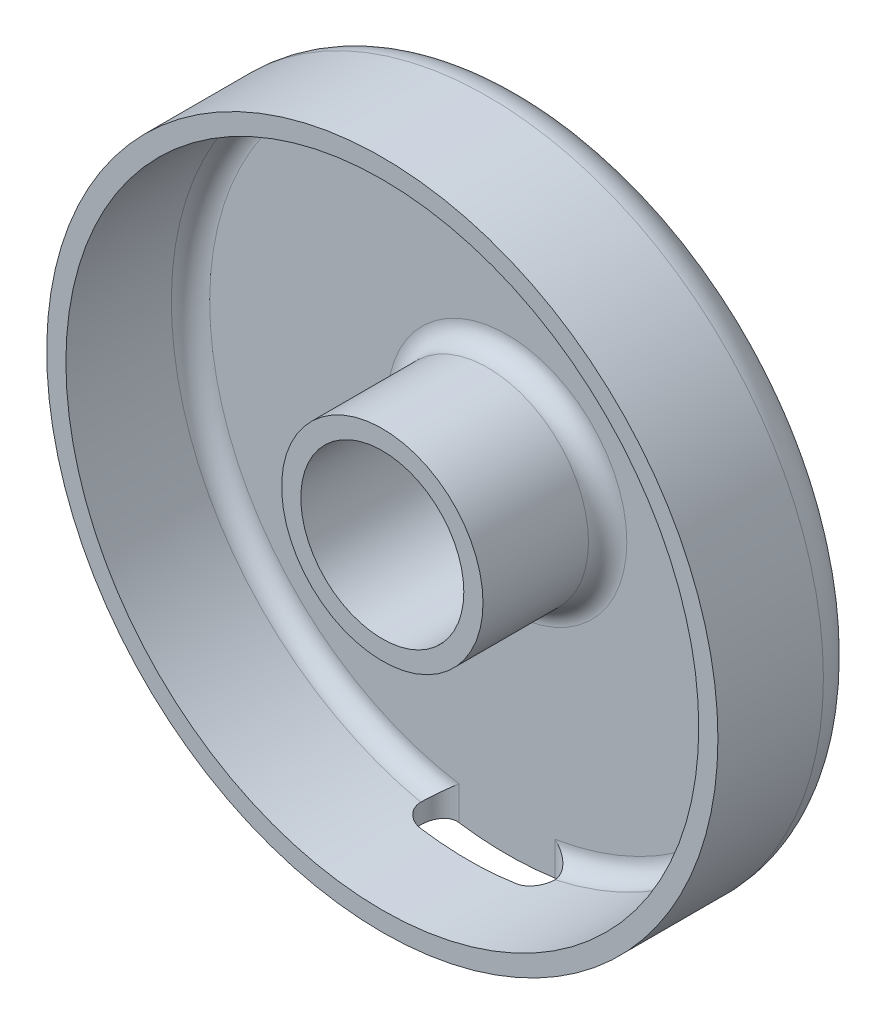
ISO-10303-21;
HEADER;
FILE_DESCRIPTION(('STEP AP214'),'2;1');
FILE_NAME('part.step','',(''),(''),'','','');
FILE_SCHEMA(('AUTOMOTIVE_DESIGN { 1 0 10303 214 1 1 1 1 }'));
ENDSEC;
DATA;
#1=APPLICATION_CONTEXT('core data for automotive mechanical design processes');
#2=APPLICATION_PROTOCOL_DEFINITION('international standard','automotive_design',2000,#1);
#3=PRODUCT_CONTEXT('',#1,'mechanical');
#4=PRODUCT('Part','Part','',(#3));
#5=PRODUCT_RELATED_PRODUCT_CATEGORY('part','',(#4));
#6=PRODUCT_DEFINITION_FORMATION('','',#4);
#7=PRODUCT_DEFINITION_CONTEXT('part definition',#1,'design');
#8=PRODUCT_DEFINITION('design','',#6,#7);
#9=PRODUCT_DEFINITION_SHAPE('','',#8);
#10=(LENGTH_UNIT() NAMED_UNIT(*) SI_UNIT(.MILLI.,.METRE.));
#11=(NAMED_UNIT(*) PLANE_ANGLE_UNIT() SI_UNIT($,.RADIAN.));
#12=(NAMED_UNIT(*) SI_UNIT($,.STERADIAN.) SOLID_ANGLE_UNIT());
#13=UNCERTAINTY_MEASURE_WITH_UNIT(LENGTH_MEASURE(1.E-05),#10,'distance_accuracy_value','');
#14=(GEOMETRIC_REPRESENTATION_CONTEXT(3) GLOBAL_UNCERTAINTY_ASSIGNED_CONTEXT((#13)) GLOBAL_UNIT_ASSIGNED_CONTEXT((#10,
#11,#12)) REPRESENTATION_CONTEXT('',''));
#15=CARTESIAN_POINT('',(0.,0.,0.));
#16=DIRECTION('',(0.,0.,1.));
#17=DIRECTION('',(1.,0.,0.));
#18=AXIS2_PLACEMENT_3D('',#15,#16,#17);
#19=CARTESIAN_POINT('',(0.,0.,15.));
#20=DIRECTION('',(0.,0.,1.));
#21=DIRECTION('',(1.,0.,0.));
#22=AXIS2_PLACEMENT_3D('',#19,#20,#21);
#23=PLANE('',#22);
#24=CARTESIAN_POINT('',(0.,0.,15.));
#25=DIRECTION('',(0.,0.,1.));
#26=DIRECTION('',(1.,0.,0.));
#27=AXIS2_PLACEMENT_3D('',#24,#25,#26);
#28=CIRCLE('',#27,8.5);
#29=CARTESIAN_POINT('',(8.5,0.,15.));
#30=VERTEX_POINT('',#29);
#31=EDGE_CURVE('E173',#30,#30,#28,.T.);
#32=ORIENTED_EDGE('',*,*,#31,.F.);
#33=EDGE_LOOP('',(#32));
#34=FACE_BOUND('',#33,.T.);
#35=CARTESIAN_POINT('',(0.,0.,15.));
#36=DIRECTION('',(0.,0.,1.));
#37=DIRECTION('',(1.,0.,0.));
#38=AXIS2_PLACEMENT_3D('',#35,#36,#37);
#39=CIRCLE('',#38,10.5);
#40=CARTESIAN_POINT('',(10.5,0.,15.));
#41=VERTEX_POINT('',#40);
#42=EDGE_CURVE('E98',#41,#41,#39,.T.);
#43=ORIENTED_EDGE('',*,*,#42,.T.);
#44=EDGE_LOOP('',(#43));
#45=FACE_BOUND('',#44,.T.);
#46=ADVANCED_FACE('F33',(#34,#45),#23,.T.);
#47=CARTESIAN_POINT('',(0.,0.,15.));
#48=DIRECTION('',(0.,0.,-1.));
#49=DIRECTION('',(-1.,0.,0.));
#50=AXIS2_PLACEMENT_3D('',#47,#48,#49);
#51=CYLINDRICAL_SURFACE('',#50,35.);
#52=CARTESIAN_POINT('',(0.,0.,4.));
#53=DIRECTION('',(0.,0.,1.));
#54=DIRECTION('',(1.,0.,0.));
#55=AXIS2_PLACEMENT_3D('',#52,#53,#54);
#56=CIRCLE('',#55,35.);
#57=CARTESIAN_POINT('',(7.,-34.2928563989645,4.));
#58=VERTEX_POINT('',#57);
#59=CARTESIAN_POINT('',(-7.,-34.2928563989645,4.));
#60=VERTEX_POINT('',#59);
#61=EDGE_CURVE('E196',#58,#60,#56,.T.);
#62=ORIENTED_EDGE('',*,*,#61,.T.);
#63=CARTESIAN_POINT('',(-7.,-34.2928563989645,4.));
#64=CARTESIAN_POINT('',(-7.00000024530008,-34.2928555590461,4.05551355530177));
#65=CARTESIAN_POINT('',(-6.99768719378157,-34.2933285851383,4.11100014356259));
#66=CARTESIAN_POINT('',(-6.9884636017292,-34.2952097134133,4.22156839814736));
#67=CARTESIAN_POINT('',(-6.9815535157915,-34.2966177231365,4.27665010396523));
#68=CARTESIAN_POINT('',(-6.95401289387718,-34.3022168043985,4.44052674764076));
#69=CARTESIAN_POINT('',(-6.92657168154917,-34.3077830497015,4.54821132621806));
#70=CARTESIAN_POINT('',(-6.85437600773371,-34.3222794650378,4.75732863114436));
#71=CARTESIAN_POINT('',(-6.80961750180681,-34.3312104208836,4.8587598906155));
#72=CARTESIAN_POINT('',(-6.70414730815314,-34.3519619063264,5.05264191439974));
#73=CARTESIAN_POINT('',(-6.64343523137788,-34.3637825063906,5.14509245963118));
#74=CARTESIAN_POINT('',(-6.50713708225238,-34.3898533831215,5.3194349637285));
#75=CARTESIAN_POINT('',(-6.43140571292647,-34.404127196416,5.40120969889844));
#76=CARTESIAN_POINT('',(-6.26760925689824,-34.4343432891605,5.55096207681369));
#77=CARTESIAN_POINT('',(-6.17954109511379,-34.4502859843465,5.61893626924223));
#78=CARTESIAN_POINT('',(-5.99184757603775,-34.4834307316268,5.74039033875451));
#79=CARTESIAN_POINT('',(-5.8920440114934,-34.5006501812278,5.793589890895));
#80=CARTESIAN_POINT('',(-5.68497216612578,-34.5353744470497,5.88241609208592));
#81=CARTESIAN_POINT('',(-5.57770742555432,-34.552879124954,5.9180510113413));
#82=CARTESIAN_POINT('',(-5.39164042562375,-34.5823109799937,5.96286384332794));
#83=CARTESIAN_POINT('',(-5.31395887068838,-34.5943352148722,5.97677250905686));
#84=CARTESIAN_POINT('',(-5.15754252987711,-34.6180022564221,5.99534108602722));
#85=CARTESIAN_POINT('',(-5.07880918450185,-34.6296455218188,6.00001255556704));
#86=CARTESIAN_POINT('',(-5.,-34.6410161513776,6.));
#87=B_SPLINE_CURVE_WITH_KNOTS('',3,(#63,#64,#65,#66,#67,#68,#69,#70,#71,#72,#73,#74,#75,#76,#77,
#78,#79,#80,#81,#82,#83,#84,#85,#86),.UNSPECIFIED.,.F.,.F.,(4,2,2,2,2,2,2,2,2,2,2,4),(0.,
0.166437126251119,0.332857796146538,0.66493476339948,0.997089333811798,1.32925200499525,
1.66480026794702,2.00043231934013,2.34205427832008,2.68351523257436,2.92248444549073,
3.16115445184396),.UNSPECIFIED.);
#88=CARTESIAN_POINT('',(-5.,-34.6410161513776,6.));
#89=VERTEX_POINT('',#88);
#90=EDGE_CURVE('E93',#60,#89,#87,.T.);
#91=ORIENTED_EDGE('',*,*,#90,.T.);
#92=CARTESIAN_POINT('',(0.,0.,6.));
#93=DIRECTION('',(0.,0.,1.));
#94=DIRECTION('',(1.,0.,0.));
#95=AXIS2_PLACEMENT_3D('',#92,#93,#94);
#96=CIRCLE('',#95,35.);
#97=CARTESIAN_POINT('',(5.,-34.6410161513776,6.));
#98=VERTEX_POINT('',#97);
#99=EDGE_CURVE('E86',#89,#98,#96,.T.);
#100=ORIENTED_EDGE('',*,*,#99,.T.);
#101=CARTESIAN_POINT('',(5.,-34.6410161513776,6.));
#102=CARTESIAN_POINT('',(5.05695062841561,-34.6327968394874,5.99999935998623));
#103=CARTESIAN_POINT('',(5.11385274952817,-34.6244393737466,5.99756603626248));
#104=CARTESIAN_POINT('',(5.22720720797549,-34.6075075796392,5.98786720303881));
#105=CARTESIAN_POINT('',(5.28365957576101,-34.5989332661213,5.98060202354457));
#106=CARTESIAN_POINT('',(5.45165220241039,-34.5729991146888,5.95163769943295));
#107=CARTESIAN_POINT('',(5.56200532845806,-34.5554024172875,5.92276954139059));
#108=CARTESIAN_POINT('',(5.77620788126942,-34.5202439513139,5.84673777672149));
#109=CARTESIAN_POINT('',(5.88005477947362,-34.5026821988584,5.79956710766766));
#110=CARTESIAN_POINT('',(6.07833427206034,-34.468303957287,5.68822765776918));
#111=CARTESIAN_POINT('',(6.17276832854968,-34.4514873526527,5.62406152252932));
#112=CARTESIAN_POINT('',(6.34945874201338,-34.4193615543715,5.48051100933139));
#113=CARTESIAN_POINT('',(6.43172247410127,-34.404051449698,5.40113591536918));
#114=CARTESIAN_POINT('',(6.58172257793654,-34.3756712008395,5.22929160065911));
#115=CARTESIAN_POINT('',(6.64945685510899,-34.3626013796695,5.13682049516819));
#116=CARTESIAN_POINT('',(6.76755997390268,-34.3395358476454,4.94260196129102));
#117=CARTESIAN_POINT('',(6.81812949674207,-34.3295047700626,4.84098066405441));
#118=CARTESIAN_POINT('',(6.90140198536068,-34.3128615635967,4.63044231809053));
#119=CARTESIAN_POINT('',(6.93412015993054,-34.3062465246136,4.52153156885347));
#120=CARTESIAN_POINT('',(6.9715504714405,-34.2986543055428,4.34315718701884));
#121=CARTESIAN_POINT('',(6.98221180130755,-34.2964838790439,4.27493567951671));
#122=CARTESIAN_POINT('',(6.99643525916125,-34.2935841079102,4.13782038199207));
#123=CARTESIAN_POINT('',(7.00000701015909,-34.2928528098919,4.06892763097816));
#124=CARTESIAN_POINT('',(7.,-34.2928563989645,4.));
#125=B_SPLINE_CURVE_WITH_KNOTS('',3,(#101,#102,#103,#104,#105,#106,#107,#108,#109,#110,#111,
#112,#113,#114,#115,#116,#117,#118,#119,#120,#121,#122,#123,#124),.UNSPECIFIED.,.F.,.F.,(4,2,2,
2,2,2,2,2,2,2,2,4),(0.,0.172514735017035,0.345017688847394,0.689492877116225,1.03410112113017,
1.37865575308445,1.72300072498184,2.06739530454463,2.40761227498084,2.74753893677924,
2.95443865653663,3.16105734922718),.UNSPECIFIED.);
#126=EDGE_CURVE('E91',#98,#58,#125,.T.);
#127=ORIENTED_EDGE('',*,*,#126,.T.);
#128=EDGE_LOOP('',(#62,#91,#100,#127));
#129=FACE_BOUND('',#128,.T.);
#130=CARTESIAN_POINT('',(0.,0.,15.));
#131=DIRECTION('',(0.,0.,1.));
#132=DIRECTION('',(1.,0.,0.));
#133=AXIS2_PLACEMENT_3D('',#130,#131,#132);
#134=CIRCLE('',#133,35.);
#135=CARTESIAN_POINT('',(35.,0.,15.));
#136=VERTEX_POINT('',#135);
#137=EDGE_CURVE('E179',#136,#136,#134,.T.);
#138=ORIENTED_EDGE('',*,*,#137,.F.);
#139=EDGE_LOOP('',(#138));
#140=FACE_BOUND('',#139,.T.);
#141=ADVANCED_FACE('F89',(#129,#140),#51,.T.);
#142=CARTESIAN_POINT('',(0.,0.,15.));
#143=DIRECTION('',(0.,0.,1.));
#144=DIRECTION('',(1.,0.,0.));
#145=AXIS2_PLACEMENT_3D('',#142,#143,#144);
#146=CIRCLE('',#145,33.);
#147=CARTESIAN_POINT('',(33.,0.,15.));
#148=VERTEX_POINT('',#147);
#149=EDGE_CURVE('E170',#148,#148,#146,.T.);
#150=ORIENTED_EDGE('',*,*,#149,.F.);
#151=EDGE_LOOP('',(#150));
#152=FACE_BOUND('',#151,.T.);
#153=ORIENTED_EDGE('',*,*,#137,.T.);
#154=EDGE_LOOP('',(#153));
#155=FACE_BOUND('',#154,.T.);
#156=ADVANCED_FACE('F226',(#152,#155),#23,.T.);
#157=CARTESIAN_POINT('',(0.,0.,0.));
#158=DIRECTION('',(0.,0.,1.));
#159=DIRECTION('',(1.,0.,0.));
#160=AXIS2_PLACEMENT_3D('',#157,#158,#159);
#161=PLANE('',#160);
#162=CARTESIAN_POINT('',(0.,0.,0.));
#163=DIRECTION('',(0.,0.,1.));
#164=DIRECTION('',(1.,0.,0.));
#165=AXIS2_PLACEMENT_3D('',#162,#163,#164);
#166=CIRCLE('',#165,31.);
#167=CARTESIAN_POINT('',(31.,0.,0.));
#168=VERTEX_POINT('',#167);
#169=EDGE_CURVE('E197',#168,#168,#166,.F.);
#170=ORIENTED_EDGE('',*,*,#169,.T.);
#171=EDGE_LOOP('',(#170));
#172=FACE_BOUND('',#171,.T.);
#173=CARTESIAN_POINT('',(0.,0.,0.));
#174=DIRECTION('',(0.,0.,1.));
#175=DIRECTION('',(1.,0.,0.));
#176=AXIS2_PLACEMENT_3D('',#173,#174,#175);
#177=CIRCLE('',#176,8.5);
#178=CARTESIAN_POINT('',(8.5,0.,0.));
#179=VERTEX_POINT('',#178);
#180=EDGE_CURVE('E176',#179,#179,#177,.T.);
#181=ORIENTED_EDGE('',*,*,#180,.T.);
#182=EDGE_LOOP('',(#181));
#183=FACE_BOUND('',#182,.T.);
#184=ADVANCED_FACE('F234',(#172,#183),#161,.F.);
#185=CARTESIAN_POINT('',(0.,0.,0.));
#186=DIRECTION('',(0.,0.,1.));
#187=DIRECTION('',(1.,0.,0.));
#188=AXIS2_PLACEMENT_3D('',#185,#186,#187);
#189=CYLINDRICAL_SURFACE('',#188,8.5);
#190=ORIENTED_EDGE('',*,*,#180,.F.);
#191=EDGE_LOOP('',(#190));
#192=FACE_BOUND('',#191,.T.);
#193=ORIENTED_EDGE('',*,*,#31,.T.);
#194=EDGE_LOOP('',(#193));
#195=FACE_BOUND('',#194,.T.);
#196=ADVANCED_FACE('F156',(#192,#195),#189,.F.);
#197=CARTESIAN_POINT('',(0.,0.,15.));
#198=DIRECTION('',(0.,0.,-1.));
#199=DIRECTION('',(-1.,0.,0.));
#200=AXIS2_PLACEMENT_3D('',#197,#198,#199);
#201=CYLINDRICAL_SURFACE('',#200,33.);
#202=CARTESIAN_POINT('',(-7.,-32.2490309931942,4.));
#203=CARTESIAN_POINT('',(-7.00000032170768,-32.2490300845433,4.0554183653388));
#204=CARTESIAN_POINT('',(-6.99769511363743,-32.2495313853145,4.11080976076309));
#205=CARTESIAN_POINT('',(-6.98850331936834,-32.2515248339393,4.22118730574932));
#206=CARTESIAN_POINT('',(-6.98161721596992,-32.2530168773743,4.27617349740002));
#207=CARTESIAN_POINT('',(-6.95417489418794,-32.2589495136072,4.43975537249226));
#208=CARTESIAN_POINT('',(-6.92683433451888,-32.2648467475484,4.54724103786594));
#209=CARTESIAN_POINT('',(-6.85491812614406,-32.2802018550038,4.755965904393));
#210=CARTESIAN_POINT('',(-6.81033898978307,-32.2896604490312,4.85720383671519));
#211=CARTESIAN_POINT('',(-6.70531079680312,-32.311633739594,5.05072870338102));
#212=CARTESIAN_POINT('',(-6.64486096016607,-32.3241485863369,5.14301519747122));
#213=CARTESIAN_POINT('',(-6.50908636555804,-32.3517640090769,5.31719168869916));
#214=CARTESIAN_POINT('',(-6.43359905465917,-32.3668925782486,5.39895039837916));
#215=CARTESIAN_POINT('',(-6.27033243009698,-32.3989172663636,5.54871893968728));
#216=CARTESIAN_POINT('',(-6.18254997554881,-32.4158138366758,5.6167252472807));
#217=CARTESIAN_POINT('',(-5.99524752533596,-32.4509823782138,5.73845032167571));
#218=CARTESIAN_POINT('',(-5.89552708290978,-32.4692751675269,5.79185446027313));
#219=CARTESIAN_POINT('',(-5.68859069637451,-32.5061680039266,5.88109678797164));
#220=CARTESIAN_POINT('',(-5.58137819676597,-32.5247679068516,5.91694298947087));
#221=CARTESIAN_POINT('',(-5.39476606783739,-32.556145764789,5.96226281129005));
#222=CARTESIAN_POINT('',(-5.3164818995682,-32.5690239781842,5.97639536284738));
#223=CARTESIAN_POINT('',(-5.15882488343747,-32.5943702521645,5.9952646734719));
#224=CARTESIAN_POINT('',(-5.0794534928392,-32.6068387976806,6.00001296616534));
#225=CARTESIAN_POINT('',(-5.,-32.6190128606002,6.));
#226=B_SPLINE_CURVE_WITH_KNOTS('',3,(#202,#203,#204,#205,#206,#207,#208,#209,#210,#211,#212,
#213,#214,#215,#216,#217,#218,#219,#220,#221,#222,#223,#224,#225),.UNSPECIFIED.,.F.,.F.,(4,2,2,
2,2,2,2,2,2,2,2,4),(0.,0.166151569851381,0.332285631042078,0.663764025517769,0.995309518788622,
1.32687131001151,1.66223342130417,1.99768136009837,2.33987127835792,2.6819048956696,
2.92313431208806,3.16406706315745),.UNSPECIFIED.);
#227=CARTESIAN_POINT('',(-7.,-32.2490309931942,4.));
#228=VERTEX_POINT('',#227);
#229=CARTESIAN_POINT('',(-5.,-32.6190128606002,6.));
#230=VERTEX_POINT('',#229);
#231=EDGE_CURVE('E99',#228,#230,#226,.T.);
#232=ORIENTED_EDGE('',*,*,#231,.F.);
#233=CARTESIAN_POINT('',(0.,0.,4.));
#234=DIRECTION('',(0.,0.,1.));
#235=DIRECTION('',(1.,0.,0.));
#236=AXIS2_PLACEMENT_3D('',#233,#234,#235);
#237=CIRCLE('',#236,33.);
#238=CARTESIAN_POINT('',(7.,-32.2490309931942,4.));
#239=VERTEX_POINT('',#238);
#240=EDGE_CURVE('E193',#228,#239,#237,.F.);
#241=ORIENTED_EDGE('',*,*,#240,.T.);
#242=CARTESIAN_POINT('',(5.,-32.6190128606002,6.));
#243=CARTESIAN_POINT('',(5.05703788892853,-32.610270675137,5.99999932510374));
#244=CARTESIAN_POINT('',(5.11402444209582,-32.6013813296134,5.99755858384355));
#245=CARTESIAN_POINT('',(5.22754155933696,-32.5833715857668,5.98783131755712));
#246=CARTESIAN_POINT('',(5.2840721554855,-32.5742512038864,5.98054513645019));
#247=CARTESIAN_POINT('',(5.45229108586844,-32.5466645660512,5.95149898556187));
#248=CARTESIAN_POINT('',(5.56278263571616,-32.52794577425,5.92255117534897));
#249=CARTESIAN_POINT('',(5.77723499843109,-32.4905439043457,5.84631506738926));
#250=CARTESIAN_POINT('',(5.88119335472219,-32.4718608422076,5.79901991815695));
#251=CARTESIAN_POINT('',(6.07967080699351,-32.4352861337783,5.68738392280152));
#252=CARTESIAN_POINT('',(6.17419133790792,-32.4173943674092,5.62304567337479));
#253=CARTESIAN_POINT('',(6.35101731389473,-32.3832163411943,5.4791021739577));
#254=CARTESIAN_POINT('',(6.43333098677215,-32.3669290024229,5.39950729113726));
#255=CARTESIAN_POINT('',(6.58338632076632,-32.3367422268268,5.22716678173189));
#256=CARTESIAN_POINT('',(6.65112598633155,-32.3228431170636,5.13441935711112));
#257=CARTESIAN_POINT('',(6.76907851432686,-32.298346220925,4.93975601066958));
#258=CARTESIAN_POINT('',(6.81951902546768,-32.2877057693785,4.83798328855586));
#259=CARTESIAN_POINT('',(6.90250167300495,-32.2700679524697,4.62713171107798));
#260=CARTESIAN_POINT('',(6.93505966990316,-32.2630673591106,4.51805942655328));
#261=CARTESIAN_POINT('',(6.97205641319059,-32.255086818813,4.34011237756122));
#262=CARTESIAN_POINT('',(6.98252807544157,-32.2528198267005,4.27249072329926));
#263=CARTESIAN_POINT('',(6.99649852156503,-32.2497910932616,4.13659036793303));
#264=CARTESIAN_POINT('',(7.0000067095306,-32.2490273218645,4.06831267826646));
#265=CARTESIAN_POINT('',(7.,-32.2490309931942,4.));
#266=B_SPLINE_CURVE_WITH_KNOTS('',3,(#242,#243,#244,#245,#246,#247,#248,#249,#250,#251,#252,
#253,#254,#255,#256,#257,#258,#259,#260,#261,#262,#263,#264,#265),.UNSPECIFIED.,.F.,.F.,(4,2,2,
2,2,2,2,2,2,2,2,4),(0.,0.17300405358368,0.345995829007623,0.691451772923759,1.03703684555706,
1.38256929490764,1.72786777552686,2.07321350622467,2.41382258836363,2.75412908494541,
2.95918188228904,3.16395756923127),.UNSPECIFIED.);
#267=CARTESIAN_POINT('',(5.,-32.6190128606002,6.));
#268=VERTEX_POINT('',#267);
#269=EDGE_CURVE('E49',#268,#239,#266,.T.);
#270=ORIENTED_EDGE('',*,*,#269,.F.);
#271=CARTESIAN_POINT('',(0.,0.,6.));
#272=DIRECTION('',(0.,0.,1.));
#273=DIRECTION('',(1.,0.,0.));
#274=AXIS2_PLACEMENT_3D('',#271,#272,#273);
#275=CIRCLE('',#274,33.);
#276=EDGE_CURVE('E11',#230,#268,#275,.T.);
#277=ORIENTED_EDGE('',*,*,#276,.F.);
#278=EDGE_LOOP('',(#232,#241,#270,#277));
#279=FACE_BOUND('',#278,.T.);
#280=ORIENTED_EDGE('',*,*,#149,.T.);
#281=EDGE_LOOP('',(#280));
#282=FACE_BOUND('',#281,.T.);
#283=ADVANCED_FACE('F151',(#279,#282),#201,.F.);
#284=CARTESIAN_POINT('',(0.,0.,2.));
#285=DIRECTION('',(0.,0.,1.));
#286=DIRECTION('',(1.,0.,0.));
#287=AXIS2_PLACEMENT_3D('',#284,#285,#286);
#288=PLANE('',#287);
#289=CARTESIAN_POINT('',(0.,0.,2.));
#290=DIRECTION('',(0.,0.,1.));
#291=DIRECTION('',(1.,0.,0.));
#292=AXIS2_PLACEMENT_3D('',#289,#290,#291);
#293=CIRCLE('',#292,31.);
#294=CARTESIAN_POINT('',(5.,-30.5941170815567,2.));
#295=VERTEX_POINT('',#294);
#296=CARTESIAN_POINT('',(-5.,-30.5941170815567,2.));
#297=VERTEX_POINT('',#296);
#298=EDGE_CURVE('E187',#295,#297,#293,.T.);
#299=ORIENTED_EDGE('',*,*,#298,.T.);
#300=DIRECTION('',(0.,1.,0.));
#301=VECTOR('',#300,1.);
#302=CARTESIAN_POINT('',(-5.,-35.,2.));
#303=LINE('',#302,#301);
#304=CARTESIAN_POINT('',(-5.,-34.0994765376031,2.));
#305=VERTEX_POINT('',#304);
#306=EDGE_CURVE('E106',#305,#297,#303,.T.);
#307=ORIENTED_EDGE('',*,*,#306,.F.);
#308=CARTESIAN_POINT('',(0.,0.,2.));
#309=DIRECTION('',(0.,0.,-1.));
#310=DIRECTION('',(-1.,0.,0.));
#311=AXIS2_PLACEMENT_3D('',#308,#309,#310);
#312=CIRCLE('',#311,34.4641016151378);
#313=CARTESIAN_POINT('',(5.,-34.0994765376031,2.));
#314=VERTEX_POINT('',#313);
#315=EDGE_CURVE('E201',#305,#314,#312,.F.);
#316=ORIENTED_EDGE('',*,*,#315,.T.);
#317=DIRECTION('',(0.,1.,0.));
#318=VECTOR('',#317,1.);
#319=CARTESIAN_POINT('',(5.,-35.,2.));
#320=LINE('',#319,#318);
#321=EDGE_CURVE('E55',#314,#295,#320,.T.);
#322=ORIENTED_EDGE('',*,*,#321,.T.);
#323=EDGE_LOOP('',(#299,#307,#316,#322));
#324=FACE_BOUND('',#323,.T.);
#325=CARTESIAN_POINT('',(0.,0.,2.));
#326=DIRECTION('',(0.,0.,1.));
#327=DIRECTION('',(1.,0.,0.));
#328=AXIS2_PLACEMENT_3D('',#325,#326,#327);
#329=CIRCLE('',#328,12.5);
#330=CARTESIAN_POINT('',(12.5,0.,2.));
#331=VERTEX_POINT('',#330);
#332=EDGE_CURVE('E190',#331,#331,#329,.F.);
#333=ORIENTED_EDGE('',*,*,#332,.T.);
#334=EDGE_LOOP('',(#333));
#335=FACE_BOUND('',#334,.T.);
#336=ADVANCED_FACE('F155',(#324,#335),#288,.T.);
#337=CARTESIAN_POINT('',(0.,0.,0.));
#338=DIRECTION('',(0.,0.,1.));
#339=DIRECTION('',(1.,0.,0.));
#340=AXIS2_PLACEMENT_3D('',#337,#338,#339);
#341=CYLINDRICAL_SURFACE('',#340,10.5);
#342=CARTESIAN_POINT('',(0.,0.,4.));
#343=DIRECTION('',(0.,0.,1.));
#344=DIRECTION('',(1.,0.,0.));
#345=AXIS2_PLACEMENT_3D('',#342,#343,#344);
#346=CIRCLE('',#345,10.5);
#347=CARTESIAN_POINT('',(10.5,0.,4.));
#348=VERTEX_POINT('',#347);
#349=EDGE_CURVE('E184',#348,#348,#346,.T.);
#350=ORIENTED_EDGE('',*,*,#349,.T.);
#351=EDGE_LOOP('',(#350));
#352=FACE_BOUND('',#351,.T.);
#353=ORIENTED_EDGE('',*,*,#42,.F.);
#354=EDGE_LOOP('',(#353));
#355=FACE_BOUND('',#354,.T.);
#356=ADVANCED_FACE('F252',(#352,#355),#341,.T.);
#357=CARTESIAN_POINT('',(0.,0.,4.));
#358=DIRECTION('',(0.,0.,1.));
#359=DIRECTION('',(1.,0.,0.));
#360=AXIS2_PLACEMENT_3D('',#357,#358,#359);
#361=TOROIDAL_SURFACE('',#360,12.5,2.);
#362=ORIENTED_EDGE('',*,*,#332,.F.);
#363=EDGE_LOOP('',(#362));
#364=FACE_BOUND('',#363,.T.);
#365=ORIENTED_EDGE('',*,*,#349,.F.);
#366=EDGE_LOOP('',(#365));
#367=FACE_BOUND('',#366,.T.);
#368=ADVANCED_FACE('F221',(#364,#367),#361,.F.);
#369=CARTESIAN_POINT('',(0.,0.,4.));
#370=DIRECTION('',(0.,0.,1.));
#371=DIRECTION('',(1.,0.,0.));
#372=AXIS2_PLACEMENT_3D('',#369,#370,#371);
#373=TOROIDAL_SURFACE('',#372,31.,2.);
#374=ORIENTED_EDGE('',*,*,#240,.F.);
#375=CARTESIAN_POINT('',(-6.99999999,-32.2490309851319,4.0002));
#376=CARTESIAN_POINT('',(-7.00001484640282,-32.2490426103239,3.95279878732765));
#377=CARTESIAN_POINT('',(-6.99832462977569,-32.2476802585834,3.90540389690484));
#378=CARTESIAN_POINT('',(-6.99161148872657,-32.2422674567667,3.81102991617514));
#379=CARTESIAN_POINT('',(-6.98659034796843,-32.2382184453593,3.76405061696093));
#380=CARTESIAN_POINT('',(-6.97333394934684,-32.2275253798901,3.67114886981485));
#381=CARTESIAN_POINT('',(-6.96511884969167,-32.22089760115,3.62522166984233));
#382=CARTESIAN_POINT('',(-6.94561984181705,-32.2051594248597,3.53446714534701));
#383=CARTESIAN_POINT('',(-6.93433567349655,-32.1960488168917,3.48963991439688));
#384=CARTESIAN_POINT('',(-6.89617622518014,-32.1652232758017,3.35743044878589));
#385=CARTESIAN_POINT('',(-6.86495634041712,-32.1399843076301,3.27206528001837));
#386=CARTESIAN_POINT('',(-6.7926132802856,-32.0814080826102,3.1086186444367));
#387=CARTESIAN_POINT('',(-6.75147674796166,-32.0480599027497,3.03054720018715));
#388=CARTESIAN_POINT('',(-6.6577581705554,-31.9719403946093,2.87728709962706));
#389=CARTESIAN_POINT('',(-6.60455580689062,-31.928655528664,2.80273556710219));
#390=CARTESIAN_POINT('',(-6.49084897974946,-31.8359278843265,2.66379463382257));
#391=CARTESIAN_POINT('',(-6.43034116918357,-31.7864822829756,2.59940992255074));
#392=CARTESIAN_POINT('',(-6.2721304988293,-31.6568601477921,2.45126575807724));
#393=CARTESIAN_POINT('',(-6.17092830764083,-31.5736564623281,2.37385950555279));
#394=CARTESIAN_POINT('',(-5.96046499440294,-31.3998689556251,2.24129739785219));
#395=CARTESIAN_POINT('',(-5.85118612777133,-31.3092688357473,2.18619236754821));
#396=CARTESIAN_POINT('',(-5.62051956716443,-31.1171472989718,2.09437911199694));
#397=CARTESIAN_POINT('',(-5.49881296498772,-31.0153017582281,2.05916893850445));
#398=CARTESIAN_POINT('',(-5.2535478008938,-30.809009962717,2.01222400219097));
#399=CARTESIAN_POINT('',(-5.12999428390842,-30.7045704083648,2.00043406761524));
#400=CARTESIAN_POINT('',(-5.00457376990817,-30.5980038548479,2.00000392405555));
#401=CARTESIAN_POINT('',(-5.00228680772403,-30.5960604959448,2.00000000202132));
#402=CARTESIAN_POINT('',(-5.,-30.5941170815567,2.));
#403=B_SPLINE_CURVE_WITH_KNOTS('',3,(#375,#376,#377,#378,#379,#380,#381,#382,#383,#384,#385,
#386,#387,#388,#389,#390,#391,#392,#393,#394,#395,#396,#397,#398,#399,#400,#401,#402),
.UNSPECIFIED.,.F.,.F.,(4,2,2,2,2,2,2,2,2,2,2,2,2,4),(0.,0.14214281623841,0.284209578337639,
0.425393893153759,0.566590176954808,0.84821382829728,1.13021894537185,1.43301964249942,
1.73595960211498,2.18999461998546,2.64505864211021,3.13093095113405,3.61565731247322,
3.62466072707662),.UNSPECIFIED.);
#404=EDGE_CURVE('E165',#228,#297,#403,.T.);
#405=ORIENTED_EDGE('',*,*,#404,.T.);
#406=ORIENTED_EDGE('',*,*,#298,.F.);
#407=CARTESIAN_POINT('',(5.,-30.5941170815567,2.));
#408=CARTESIAN_POINT('',(5.00228680530062,-30.596060493999,2.00000000241326));
#409=CARTESIAN_POINT('',(5.00457376748023,-30.5980038528967,2.00000392443024));
#410=CARTESIAN_POINT('',(5.13557923053089,-30.7093157861689,2.00045320025271));
#411=CARTESIAN_POINT('',(5.26476437213546,-30.8184898738567,2.01331569576353));
#412=CARTESIAN_POINT('',(5.5209627768132,-31.0338797135704,2.06461431542902));
#413=CARTESIAN_POINT('',(5.64797057666306,-31.1400883537962,2.10310719589956));
#414=CARTESIAN_POINT('',(5.88049451099174,-31.3335903525382,2.20039770766979));
#415=CARTESIAN_POINT('',(5.98671725557002,-31.4215920690103,2.256069422756));
#416=CARTESIAN_POINT('',(6.19120128659427,-31.5903395670071,2.38883431457846));
#417=CARTESIAN_POINT('',(6.28947543778914,-31.6710970972874,2.46589194455983));
#418=CARTESIAN_POINT('',(6.45386433346956,-31.80573009507,2.62294992981013));
#419=CARTESIAN_POINT('',(6.5223411583675,-31.8616448303582,2.69872201680249));
#420=CARTESIAN_POINT('',(6.64905059979442,-31.9648758556261,2.86359991150911));
#421=CARTESIAN_POINT('',(6.70729352651367,-32.0122008010356,2.95269213030394));
#422=CARTESIAN_POINT('',(6.80182450476143,-32.0888781267529,3.12730574559243));
#423=CARTESIAN_POINT('',(6.84015030585827,-32.1199082986452,3.21098261635888));
#424=CARTESIAN_POINT('',(6.90546334252445,-32.1727337330387,3.38531567025686));
#425=CARTESIAN_POINT('',(6.9324702313453,-32.1945450030652,3.47595942997076));
#426=CARTESIAN_POINT('',(6.96844237952133,-32.223580777246,3.63892362558995));
#427=CARTESIAN_POINT('',(6.98021900006908,-32.2330797526539,3.71022432119429));
#428=CARTESIAN_POINT('',(6.99205994586286,-32.2426290244688,3.81829111655349));
#429=CARTESIAN_POINT('',(6.99503633502045,-32.2450289716526,3.85455613918368));
#430=CARTESIAN_POINT('',(6.99900965996828,-32.2482325637896,3.9272774305957));
#431=CARTESIAN_POINT('',(7.00000589250847,-32.2490356416169,3.96373376271374));
#432=CARTESIAN_POINT('',(6.99999999,-32.249030985132,4.0002));
#433=B_SPLINE_CURVE_WITH_KNOTS('',3,(#407,#408,#409,#410,#411,#412,#413,#414,#415,#416,#417,
#418,#419,#420,#421,#422,#423,#424,#425,#426,#427,#428,#429,#430,#431,#432),.UNSPECIFIED.,.F.,
.F.,(4,2,2,2,2,2,2,2,2,2,2,2,4),(0.,0.0090034146034045,0.515714911301165,1.02355222599861,
1.46814127598731,1.91199572974529,2.26000900174994,2.60766963037855,2.89785633144063,
3.18753706699751,3.4054970980772,3.51481484846755,3.62417141598283),.UNSPECIFIED.);
#434=EDGE_CURVE('E105',#295,#239,#433,.T.);
#435=ORIENTED_EDGE('',*,*,#434,.T.);
#436=EDGE_LOOP('',(#374,#405,#406,#435));
#437=FACE_BOUND('',#436,.T.);
#438=ADVANCED_FACE('F216',(#437),#373,.F.);
#439=CARTESIAN_POINT('',(0.,0.,4.));
#440=DIRECTION('',(0.,0.,1.));
#441=DIRECTION('',(1.,0.,0.));
#442=AXIS2_PLACEMENT_3D('',#439,#440,#441);
#443=TOROIDAL_SURFACE('',#442,31.,4.);
#444=CARTESIAN_POINT('',(-6.99999999,-34.2928563959026,4.0002));
#445=CARTESIAN_POINT('',(-7.00001229755739,-34.2928655749281,3.94520710716796));
#446=CARTESIAN_POINT('',(-6.99774295280627,-34.2921654655153,3.89021825854975));
#447=CARTESIAN_POINT('',(-6.98869384167864,-34.2894021426535,3.78065913998069));
#448=CARTESIAN_POINT('',(-6.98191506402654,-34.2873392280095,3.72608878092557));
#449=CARTESIAN_POINT('',(-6.96392452530632,-34.2819131413242,3.61790058329553));
#450=CARTESIAN_POINT('',(-6.95272491922048,-34.2785535350691,3.56428055069335));
#451=CARTESIAN_POINT('',(-6.92600169857854,-34.2706452412114,3.45823296624109));
#452=CARTESIAN_POINT('',(-6.91047798049092,-34.2660965251383,3.4058054429756));
#453=CARTESIAN_POINT('',(-6.85760748321813,-34.2508703501367,3.25088626024712));
#454=CARTESIAN_POINT('',(-6.81393931334351,-34.2386057662242,3.15062680001904));
#455=CARTESIAN_POINT('',(-6.71109081404948,-34.2113884928983,2.95882760853532));
#456=CARTESIAN_POINT('',(-6.65190119316748,-34.1964341950562,2.86729314514608));
#457=CARTESIAN_POINT('',(-6.51766105886833,-34.1653974452068,2.69264863591021));
#458=CARTESIAN_POINT('',(-6.44221006175964,-34.149295065228,2.60984925055625));
#459=CARTESIAN_POINT('',(-6.27834428807827,-34.1189061227061,2.45781652053363));
#460=CARTESIAN_POINT('',(-6.18992769939203,-34.104619814505,2.38858507533002));
#461=CARTESIAN_POINT('',(-6.00125987753539,-34.0805406443846,2.26496928762886));
#462=CARTESIAN_POINT('',(-5.90089020694975,-34.0707984315024,2.2107549124249));
#463=CARTESIAN_POINT('',(-5.69204810664867,-34.058883022232,2.1201106362024));
#464=CARTESIAN_POINT('',(-5.58358678413507,-34.0566996384398,2.08365685538009));
#465=CARTESIAN_POINT('',(-5.39534185697439,-34.0611578720739,2.03783291734041));
#466=CARTESIAN_POINT('',(-5.3166413189653,-34.0653641125357,2.02362949516223));
#467=CARTESIAN_POINT('',(-5.15844927877507,-34.0786957157688,2.00468459096633));
#468=CARTESIAN_POINT('',(-5.07895712178698,-34.0878255529859,1.99995173402719));
#469=CARTESIAN_POINT('',(-4.9998,-34.0995058688025,2.00000001));
#470=B_SPLINE_CURVE_WITH_KNOTS('',3,(#444,#445,#446,#447,#448,#449,#450,#451,#452,#453,#454,
#455,#456,#457,#458,#459,#460,#461,#462,#463,#464,#465,#466,#467,#468,#469),.UNSPECIFIED.,.F.,
.F.,(4,2,2,2,2,2,2,2,2,2,2,2,4),(0.,0.164919852433633,0.32980355695985,0.494237039854566,
0.658674460092764,0.987154675993847,1.3158319776318,1.65378523652985,1.99178577398003,
2.33346862612775,2.67469079592113,2.9142550715955,3.15403742527708),.UNSPECIFIED.);
#471=EDGE_CURVE('E42',#60,#305,#470,.T.);
#472=ORIENTED_EDGE('',*,*,#471,.F.);
#473=ORIENTED_EDGE('',*,*,#61,.F.);
#474=CARTESIAN_POINT('',(4.9998,-34.0995058688025,2.00000001));
#475=CARTESIAN_POINT('',(5.05081618146971,-34.0920095016979,1.99998663585463));
#476=CARTESIAN_POINT('',(5.10198374369044,-34.0855390821955,2.00194169987575));
#477=CARTESIAN_POINT('',(5.20422559089393,-34.0746523289558,2.00979604115281));
#478=CARTESIAN_POINT('',(5.25529989015742,-34.070235648849,2.0156946529081));
#479=CARTESIAN_POINT('',(5.35677195041052,-34.0634696835505,2.03141171097801));
#480=CARTESIAN_POINT('',(5.40717160741495,-34.0611121457078,2.04121427865789));
#481=CARTESIAN_POINT('',(5.50710461786182,-34.058340351225,2.06467491349434));
#482=CARTESIAN_POINT('',(5.55663798204316,-34.0579260704786,2.07833293282126));
#483=CARTESIAN_POINT('',(5.70338138769724,-34.0593913903913,2.12496407385246));
#484=CARTESIAN_POINT('',(5.79883410258556,-34.0639731063638,2.16360972573894));
#485=CARTESIAN_POINT('',(5.98234319300553,-34.0786032764521,2.25485324514157));
#486=CARTESIAN_POINT('',(6.0703936080732,-34.0886560882273,2.30746221713264));
#487=CARTESIAN_POINT('',(6.24026785263026,-34.1125469163323,2.42744089751185));
#488=CARTESIAN_POINT('',(6.32173587339393,-34.1265123840988,2.49528887830426));
#489=CARTESIAN_POINT('',(6.47285506362491,-34.1557073858034,2.64284782990165));
#490=CARTESIAN_POINT('',(6.54250241141673,-34.1709373261902,2.72256262172246));
#491=CARTESIAN_POINT('',(6.67279829553032,-34.201562024457,2.89796401612074));
#492=CARTESIAN_POINT('',(6.73249223870831,-34.2168954279851,2.99437370700027));
#493=CARTESIAN_POINT('',(6.83486314248239,-34.2443820063922,3.19621324174513));
#494=CARTESIAN_POINT('',(6.87754902088121,-34.2565368467284,3.30163832327429));
#495=CARTESIAN_POINT('',(6.94039208265754,-34.2748302214944,3.505246617716));
#496=CARTESIAN_POINT('',(6.96267758634015,-34.2815256471771,3.60272079794578));
#497=CARTESIAN_POINT('',(6.98503823529612,-34.2882899189693,3.75074747630076));
#498=CARTESIAN_POINT('',(6.990647237018,-34.2899982611516,3.80044323112519));
#499=CARTESIAN_POINT('',(6.99813169384871,-34.2922840535766,3.90015296025079));
#500=CARTESIAN_POINT('',(7.00000624006099,-34.2928612285138,3.95016700904819));
#501=CARTESIAN_POINT('',(6.99999999,-34.2928563959026,4.0002));
#502=B_SPLINE_CURVE_WITH_KNOTS('',3,(#474,#475,#476,#477,#478,#479,#480,#481,#482,#483,#484,
#485,#486,#487,#488,#489,#490,#491,#492,#493,#494,#495,#496,#497,#498,#499,#500,#501),
.UNSPECIFIED.,.F.,.F.,(4,2,2,2,2,2,2,2,2,2,2,2,2,4),(0.,0.154644311395204,0.309262532090925,
0.463258190765726,0.617251939096861,0.924941138967601,1.23287576886167,1.55232169829531,
1.87187071007386,2.21350437461806,2.55495867463676,2.85432642438581,3.00431267325957,
3.15433542152042),.UNSPECIFIED.);
#503=EDGE_CURVE('E104',#314,#58,#502,.T.);
#504=ORIENTED_EDGE('',*,*,#503,.F.);
#505=ORIENTED_EDGE('',*,*,#315,.F.);
#506=EDGE_LOOP('',(#472,#473,#504,#505));
#507=FACE_BOUND('',#506,.T.);
#508=ORIENTED_EDGE('',*,*,#169,.F.);
#509=EDGE_LOOP('',(#508));
#510=FACE_BOUND('',#509,.T.);
#511=ADVANCED_FACE('F35',(#507,#510),#443,.T.);
#512=CARTESIAN_POINT('',(-5.,-35.,6.));
#513=DIRECTION('',(0.,0.,1.));
#514=DIRECTION('',(1.,0.,0.));
#515=AXIS2_PLACEMENT_3D('',#512,#513,#514);
#516=PLANE('',#515);
#517=DIRECTION('',(0.,1.,0.));
#518=VECTOR('',#517,1.);
#519=CARTESIAN_POINT('',(-5.,-35.,6.));
#520=LINE('',#519,#518);
#521=EDGE_CURVE('E110',#89,#230,#520,.T.);
#522=ORIENTED_EDGE('',*,*,#521,.T.);
#523=ORIENTED_EDGE('',*,*,#276,.T.);
#524=DIRECTION('',(0.,1.,0.));
#525=VECTOR('',#524,1.);
#526=CARTESIAN_POINT('',(5.,-35.,6.));
#527=LINE('',#526,#525);
#528=EDGE_CURVE('E102',#98,#268,#527,.T.);
#529=ORIENTED_EDGE('',*,*,#528,.F.);
#530=ORIENTED_EDGE('',*,*,#99,.F.);
#531=EDGE_LOOP('',(#522,#523,#529,#530));
#532=FACE_BOUND('',#531,.T.);
#533=ADVANCED_FACE('F108',(#532),#516,.F.);
#534=CARTESIAN_POINT('',(-5.,-35.,4.));
#535=DIRECTION('',(0.,1.,0.));
#536=DIRECTION('',(0.,0.,1.));
#537=AXIS2_PLACEMENT_3D('',#534,#535,#536);
#538=CYLINDRICAL_SURFACE('',#537,2.);
#539=ORIENTED_EDGE('',*,*,#231,.T.);
#540=ORIENTED_EDGE('',*,*,#521,.F.);
#541=ORIENTED_EDGE('',*,*,#90,.F.);
#542=ORIENTED_EDGE('',*,*,#471,.T.);
#543=ORIENTED_EDGE('',*,*,#306,.T.);
#544=ORIENTED_EDGE('',*,*,#404,.F.);
#545=EDGE_LOOP('',(#539,#540,#541,#542,#543,#544));
#546=FACE_BOUND('',#545,.T.);
#547=ADVANCED_FACE('F131',(#546),#538,.F.);
#548=CARTESIAN_POINT('',(5.,-35.,4.));
#549=DIRECTION('',(0.,1.,0.));
#550=DIRECTION('',(0.,0.,1.));
#551=AXIS2_PLACEMENT_3D('',#548,#549,#550);
#552=CYLINDRICAL_SURFACE('',#551,2.);
#553=ORIENTED_EDGE('',*,*,#269,.T.);
#554=ORIENTED_EDGE('',*,*,#434,.F.);
#555=ORIENTED_EDGE('',*,*,#321,.F.);
#556=ORIENTED_EDGE('',*,*,#503,.T.);
#557=ORIENTED_EDGE('',*,*,#126,.F.);
#558=ORIENTED_EDGE('',*,*,#528,.T.);
#559=EDGE_LOOP('',(#553,#554,#555,#556,#557,#558));
#560=FACE_BOUND('',#559,.T.);
#561=ADVANCED_FACE('F101',(#560),#552,.F.);
#562=CLOSED_SHELL('',(#46,#141,#156,#184,#196,#283,#336,#356,#368,#438,#511,#533,#547,#561));
#563=MANIFOLD_SOLID_BREP('B2',#562);
#564=ADVANCED_BREP_SHAPE_REPRESENTATION('',(#18,#563),#14);
#565=SHAPE_DEFINITION_REPRESENTATION(#9,#564);
ENDSEC;
END-ISO-10303-21;
